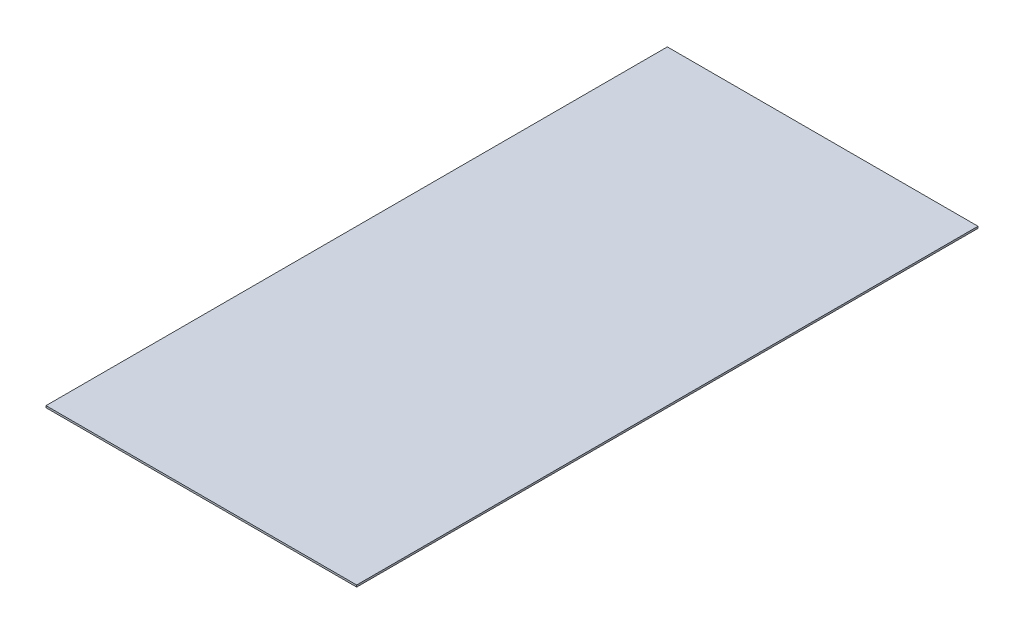
ISO-10303-21;
HEADER;
FILE_DESCRIPTION(('STEP AP214'),'2;1');
FILE_NAME('part.step','',(''),(''),'','','');
FILE_SCHEMA(('AUTOMOTIVE_DESIGN { 1 0 10303 214 1 1 1 1 }'));
ENDSEC;
DATA;
#1=APPLICATION_CONTEXT('core data for automotive mechanical design processes');
#2=APPLICATION_PROTOCOL_DEFINITION('international standard','automotive_design',2000,#1);
#3=PRODUCT_CONTEXT('',#1,'mechanical');
#4=PRODUCT('Part','Part','',(#3));
#5=PRODUCT_RELATED_PRODUCT_CATEGORY('part','',(#4));
#6=PRODUCT_DEFINITION_FORMATION('','',#4);
#7=PRODUCT_DEFINITION_CONTEXT('part definition',#1,'design');
#8=PRODUCT_DEFINITION('design','',#6,#7);
#9=PRODUCT_DEFINITION_SHAPE('','',#8);
#10=(LENGTH_UNIT() NAMED_UNIT(*) SI_UNIT(.MILLI.,.METRE.));
#11=(NAMED_UNIT(*) PLANE_ANGLE_UNIT() SI_UNIT($,.RADIAN.));
#12=(NAMED_UNIT(*) SI_UNIT($,.STERADIAN.) SOLID_ANGLE_UNIT());
#13=UNCERTAINTY_MEASURE_WITH_UNIT(LENGTH_MEASURE(1.E-05),#10,'distance_accuracy_value','');
#14=(GEOMETRIC_REPRESENTATION_CONTEXT(3) GLOBAL_UNCERTAINTY_ASSIGNED_CONTEXT((#13)) GLOBAL_UNIT_ASSIGNED_CONTEXT((#10,
#11,#12)) REPRESENTATION_CONTEXT('',''));
#15=CARTESIAN_POINT('',(0.,0.,0.));
#16=DIRECTION('',(0.,0.,1.));
#17=DIRECTION('',(1.,0.,0.));
#18=AXIS2_PLACEMENT_3D('',#15,#16,#17);
#19=CARTESIAN_POINT('',(0.,3.,0.));
#20=DIRECTION('',(1.,0.,0.));
#21=DIRECTION('',(0.,0.,-1.));
#22=AXIS2_PLACEMENT_3D('',#19,#20,#21);
#23=PLANE('',#22);
#24=DIRECTION('',(0.,0.,1.));
#25=VECTOR('',#24,1.);
#26=CARTESIAN_POINT('',(0.,0.,0.));
#27=LINE('',#26,#25);
#28=CARTESIAN_POINT('',(0.,0.,-1000.));
#29=VERTEX_POINT('',#28);
#30=CARTESIAN_POINT('',(0.,0.,0.));
#31=VERTEX_POINT('',#30);
#32=EDGE_CURVE('E96',#29,#31,#27,.T.);
#33=ORIENTED_EDGE('',*,*,#32,.T.);
#34=DIRECTION('',(0.,-1.,0.));
#35=VECTOR('',#34,1.);
#36=CARTESIAN_POINT('',(0.,3.,0.));
#37=LINE('',#36,#35);
#38=CARTESIAN_POINT('',(0.,3.,0.));
#39=VERTEX_POINT('',#38);
#40=EDGE_CURVE('E11',#39,#31,#37,.T.);
#41=ORIENTED_EDGE('',*,*,#40,.F.);
#42=DIRECTION('',(0.,0.,1.));
#43=VECTOR('',#42,1.);
#44=CARTESIAN_POINT('',(0.,3.,0.));
#45=LINE('',#44,#43);
#46=CARTESIAN_POINT('',(0.,3.,-1000.));
#47=VERTEX_POINT('',#46);
#48=EDGE_CURVE('E84',#47,#39,#45,.T.);
#49=ORIENTED_EDGE('',*,*,#48,.F.);
#50=DIRECTION('',(0.,-1.,0.));
#51=VECTOR('',#50,1.);
#52=CARTESIAN_POINT('',(0.,3.,-1000.));
#53=LINE('',#52,#51);
#54=EDGE_CURVE('E92',#47,#29,#53,.T.);
#55=ORIENTED_EDGE('',*,*,#54,.T.);
#56=EDGE_LOOP('',(#33,#41,#49,#55));
#57=FACE_BOUND('',#56,.T.);
#58=ADVANCED_FACE('F33',(#57),#23,.F.);
#59=CARTESIAN_POINT('',(0.,3.,0.));
#60=DIRECTION('',(0.,0.,-1.));
#61=DIRECTION('',(-1.,0.,0.));
#62=AXIS2_PLACEMENT_3D('',#59,#60,#61);
#63=PLANE('',#62);
#64=DIRECTION('',(1.,0.,0.));
#65=VECTOR('',#64,1.);
#66=CARTESIAN_POINT('',(0.,0.,0.));
#67=LINE('',#66,#65);
#68=CARTESIAN_POINT('',(500.,0.,0.));
#69=VERTEX_POINT('',#68);
#70=EDGE_CURVE('E88',#31,#69,#67,.T.);
#71=ORIENTED_EDGE('',*,*,#70,.T.);
#72=DIRECTION('',(0.,-1.,0.));
#73=VECTOR('',#72,1.);
#74=CARTESIAN_POINT('',(500.,3.,0.));
#75=LINE('',#74,#73);
#76=CARTESIAN_POINT('',(500.,3.,0.));
#77=VERTEX_POINT('',#76);
#78=EDGE_CURVE('E41',#77,#69,#75,.T.);
#79=ORIENTED_EDGE('',*,*,#78,.F.);
#80=DIRECTION('',(1.,0.,0.));
#81=VECTOR('',#80,1.);
#82=CARTESIAN_POINT('',(0.,3.,0.));
#83=LINE('',#82,#81);
#84=EDGE_CURVE('E79',#39,#77,#83,.T.);
#85=ORIENTED_EDGE('',*,*,#84,.F.);
#86=ORIENTED_EDGE('',*,*,#40,.T.);
#87=EDGE_LOOP('',(#71,#79,#85,#86));
#88=FACE_BOUND('',#87,.T.);
#89=ADVANCED_FACE('F87',(#88),#63,.F.);
#90=CARTESIAN_POINT('',(500.,3.,0.));
#91=DIRECTION('',(-1.,0.,0.));
#92=DIRECTION('',(0.,0.,1.));
#93=AXIS2_PLACEMENT_3D('',#90,#91,#92);
#94=PLANE('',#93);
#95=DIRECTION('',(0.,0.,-1.));
#96=VECTOR('',#95,1.);
#97=CARTESIAN_POINT('',(500.,0.,0.));
#98=LINE('',#97,#96);
#99=CARTESIAN_POINT('',(500.,0.,-1000.));
#100=VERTEX_POINT('',#99);
#101=EDGE_CURVE('E66',#69,#100,#98,.T.);
#102=ORIENTED_EDGE('',*,*,#101,.T.);
#103=DIRECTION('',(0.,-1.,0.));
#104=VECTOR('',#103,1.);
#105=CARTESIAN_POINT('',(500.,3.,-1000.));
#106=LINE('',#105,#104);
#107=CARTESIAN_POINT('',(500.,3.,-1000.));
#108=VERTEX_POINT('',#107);
#109=EDGE_CURVE('E89',#108,#100,#106,.T.);
#110=ORIENTED_EDGE('',*,*,#109,.F.);
#111=DIRECTION('',(0.,0.,-1.));
#112=VECTOR('',#111,1.);
#113=CARTESIAN_POINT('',(500.,3.,0.));
#114=LINE('',#113,#112);
#115=EDGE_CURVE('E82',#77,#108,#114,.T.);
#116=ORIENTED_EDGE('',*,*,#115,.F.);
#117=ORIENTED_EDGE('',*,*,#78,.T.);
#118=EDGE_LOOP('',(#102,#110,#116,#117));
#119=FACE_BOUND('',#118,.T.);
#120=ADVANCED_FACE('F90',(#119),#94,.F.);
#121=CARTESIAN_POINT('',(0.,3.,-1000.));
#122=DIRECTION('',(0.,0.,1.));
#123=DIRECTION('',(1.,0.,0.));
#124=AXIS2_PLACEMENT_3D('',#121,#122,#123);
#125=PLANE('',#124);
#126=DIRECTION('',(-1.,0.,0.));
#127=VECTOR('',#126,1.);
#128=CARTESIAN_POINT('',(0.,0.,-1000.));
#129=LINE('',#128,#127);
#130=EDGE_CURVE('E72',#100,#29,#129,.T.);
#131=ORIENTED_EDGE('',*,*,#130,.T.);
#132=ORIENTED_EDGE('',*,*,#54,.F.);
#133=DIRECTION('',(-1.,0.,0.));
#134=VECTOR('',#133,1.);
#135=CARTESIAN_POINT('',(0.,3.,-1000.));
#136=LINE('',#135,#134);
#137=EDGE_CURVE('E49',#108,#47,#136,.T.);
#138=ORIENTED_EDGE('',*,*,#137,.F.);
#139=ORIENTED_EDGE('',*,*,#109,.T.);
#140=EDGE_LOOP('',(#131,#132,#138,#139));
#141=FACE_BOUND('',#140,.T.);
#142=ADVANCED_FACE('F103',(#141),#125,.F.);
#143=CARTESIAN_POINT('',(0.,3.,0.));
#144=DIRECTION('',(0.,-1.,0.));
#145=DIRECTION('',(0.,0.,-1.));
#146=AXIS2_PLACEMENT_3D('',#143,#144,#145);
#147=PLANE('',#146);
#148=ORIENTED_EDGE('',*,*,#48,.T.);
#149=ORIENTED_EDGE('',*,*,#84,.T.);
#150=ORIENTED_EDGE('',*,*,#115,.T.);
#151=ORIENTED_EDGE('',*,*,#137,.T.);
#152=EDGE_LOOP('',(#148,#149,#150,#151));
#153=FACE_BOUND('',#152,.T.);
#154=ADVANCED_FACE('F80',(#153),#147,.F.);
#155=CARTESIAN_POINT('',(0.,0.,0.));
#156=DIRECTION('',(0.,-1.,0.));
#157=DIRECTION('',(0.,0.,-1.));
#158=AXIS2_PLACEMENT_3D('',#155,#156,#157);
#159=PLANE('',#158);
#160=ORIENTED_EDGE('',*,*,#32,.F.);
#161=ORIENTED_EDGE('',*,*,#130,.F.);
#162=ORIENTED_EDGE('',*,*,#101,.F.);
#163=ORIENTED_EDGE('',*,*,#70,.F.);
#164=EDGE_LOOP('',(#160,#161,#162,#163));
#165=FACE_BOUND('',#164,.T.);
#166=ADVANCED_FACE('F106',(#165),#159,.T.);
#167=CLOSED_SHELL('',(#58,#89,#120,#142,#154,#166));
#168=MANIFOLD_SOLID_BREP('B2',#167);
#169=ADVANCED_BREP_SHAPE_REPRESENTATION('',(#18,#168),#14);
#170=SHAPE_DEFINITION_REPRESENTATION(#9,#169);
ENDSEC;
END-ISO-10303-21;
